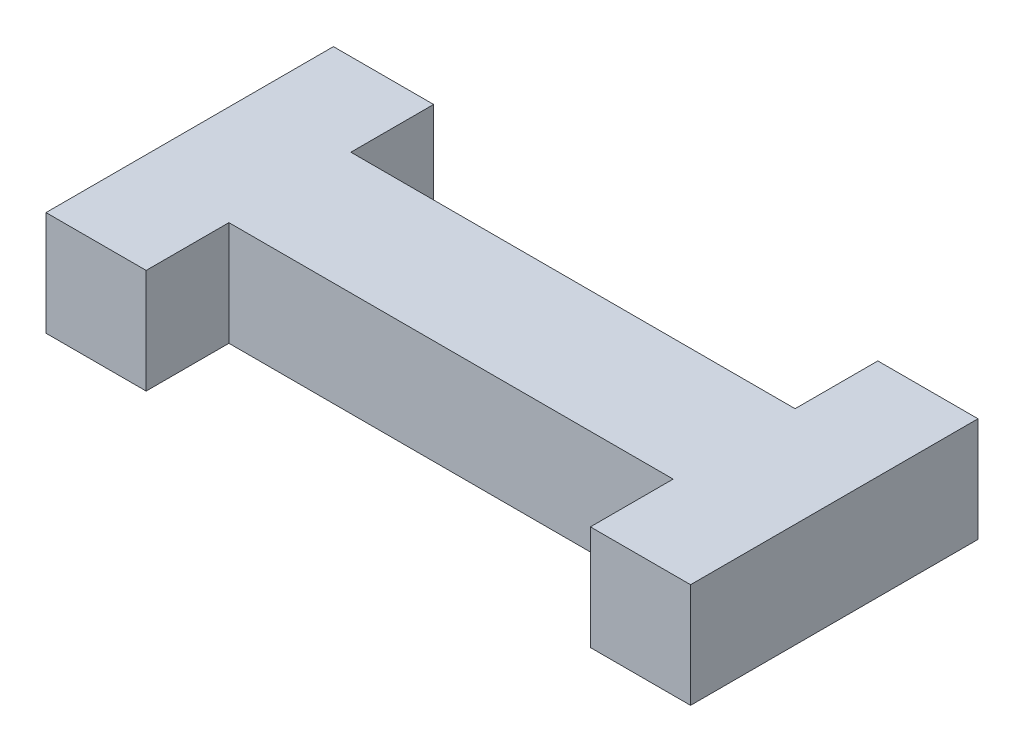
ISO-10303-21;
HEADER;
FILE_DESCRIPTION(('STEP AP214'),'2;1');
FILE_NAME('part.step','',(''),(''),'','','');
FILE_SCHEMA(('AUTOMOTIVE_DESIGN { 1 0 10303 214 1 1 1 1 }'));
ENDSEC;
DATA;
#1=APPLICATION_CONTEXT('core data for automotive mechanical design processes');
#2=APPLICATION_PROTOCOL_DEFINITION('international standard','automotive_design',2000,#1);
#3=PRODUCT_CONTEXT('',#1,'mechanical');
#4=PRODUCT('Part','Part','',(#3));
#5=PRODUCT_RELATED_PRODUCT_CATEGORY('part','',(#4));
#6=PRODUCT_DEFINITION_FORMATION('','',#4);
#7=PRODUCT_DEFINITION_CONTEXT('part definition',#1,'design');
#8=PRODUCT_DEFINITION('design','',#6,#7);
#9=PRODUCT_DEFINITION_SHAPE('','',#8);
#10=(LENGTH_UNIT() NAMED_UNIT(*) SI_UNIT(.MILLI.,.METRE.));
#11=(NAMED_UNIT(*) PLANE_ANGLE_UNIT() SI_UNIT($,.RADIAN.));
#12=(NAMED_UNIT(*) SI_UNIT($,.STERADIAN.) SOLID_ANGLE_UNIT());
#13=UNCERTAINTY_MEASURE_WITH_UNIT(LENGTH_MEASURE(1.E-05),#10,'distance_accuracy_value','');
#14=(GEOMETRIC_REPRESENTATION_CONTEXT(3) GLOBAL_UNCERTAINTY_ASSIGNED_CONTEXT((#13)) GLOBAL_UNIT_ASSIGNED_CONTEXT((#10,
#11,#12)) REPRESENTATION_CONTEXT('',''));
#15=CARTESIAN_POINT('',(0.,0.,0.));
#16=DIRECTION('',(0.,0.,1.));
#17=DIRECTION('',(1.,0.,0.));
#18=AXIS2_PLACEMENT_3D('',#15,#16,#17);
#19=CARTESIAN_POINT('',(12.954,6.096,-8.382));
#20=DIRECTION('',(0.,0.,1.));
#21=DIRECTION('',(1.,0.,0.));
#22=AXIS2_PLACEMENT_3D('',#19,#20,#21);
#23=PLANE('',#22);
#24=DIRECTION('',(-1.,0.,0.));
#25=VECTOR('',#24,1.);
#26=CARTESIAN_POINT('',(12.954,0.,-8.382));
#27=LINE('',#26,#25);
#28=CARTESIAN_POINT('',(18.796,0.,-8.382));
#29=VERTEX_POINT('',#28);
#30=CARTESIAN_POINT('',(12.954,0.,-8.382));
#31=VERTEX_POINT('',#30);
#32=EDGE_CURVE('E164',#29,#31,#27,.T.);
#33=ORIENTED_EDGE('',*,*,#32,.T.);
#34=DIRECTION('',(0.,-1.,0.));
#35=VECTOR('',#34,1.);
#36=CARTESIAN_POINT('',(12.954,6.096,-8.382));
#37=LINE('',#36,#35);
#38=CARTESIAN_POINT('',(12.954,6.096,-8.382));
#39=VERTEX_POINT('',#38);
#40=EDGE_CURVE('E11',#39,#31,#37,.T.);
#41=ORIENTED_EDGE('',*,*,#40,.F.);
#42=DIRECTION('',(-1.,0.,0.));
#43=VECTOR('',#42,1.);
#44=CARTESIAN_POINT('',(12.954,6.096,-8.382));
#45=LINE('',#44,#43);
#46=CARTESIAN_POINT('',(18.796,6.096,-8.382));
#47=VERTEX_POINT('',#46);
#48=EDGE_CURVE('E198',#47,#39,#45,.T.);
#49=ORIENTED_EDGE('',*,*,#48,.F.);
#50=DIRECTION('',(0.,-1.,0.));
#51=VECTOR('',#50,1.);
#52=CARTESIAN_POINT('',(18.796,6.096,-8.382));
#53=LINE('',#52,#51);
#54=EDGE_CURVE('E160',#47,#29,#53,.T.);
#55=ORIENTED_EDGE('',*,*,#54,.T.);
#56=EDGE_LOOP('',(#33,#41,#49,#55));
#57=FACE_BOUND('',#56,.T.);
#58=ADVANCED_FACE('F39',(#57),#23,.F.);
#59=CARTESIAN_POINT('',(12.954,6.096,-3.556));
#60=DIRECTION('',(1.,0.,0.));
#61=DIRECTION('',(0.,0.,-1.));
#62=AXIS2_PLACEMENT_3D('',#59,#60,#61);
#63=PLANE('',#62);
#64=DIRECTION('',(0.,0.,1.));
#65=VECTOR('',#64,1.);
#66=CARTESIAN_POINT('',(12.954,0.,-3.556));
#67=LINE('',#66,#65);
#68=CARTESIAN_POINT('',(12.954,0.,-3.556));
#69=VERTEX_POINT('',#68);
#70=EDGE_CURVE('E168',#31,#69,#67,.T.);
#71=ORIENTED_EDGE('',*,*,#70,.T.);
#72=DIRECTION('',(0.,-1.,0.));
#73=VECTOR('',#72,1.);
#74=CARTESIAN_POINT('',(12.954,6.096,-3.556));
#75=LINE('',#74,#73);
#76=CARTESIAN_POINT('',(12.954,6.096,-3.556));
#77=VERTEX_POINT('',#76);
#78=EDGE_CURVE('E48',#77,#69,#75,.T.);
#79=ORIENTED_EDGE('',*,*,#78,.F.);
#80=DIRECTION('',(0.,0.,1.));
#81=VECTOR('',#80,1.);
#82=CARTESIAN_POINT('',(12.954,6.096,-3.556));
#83=LINE('',#82,#81);
#84=EDGE_CURVE('E111',#39,#77,#83,.T.);
#85=ORIENTED_EDGE('',*,*,#84,.F.);
#86=ORIENTED_EDGE('',*,*,#40,.T.);
#87=EDGE_LOOP('',(#71,#79,#85,#86));
#88=FACE_BOUND('',#87,.T.);
#89=ADVANCED_FACE('F292',(#88),#63,.F.);
#90=CARTESIAN_POINT('',(12.954,6.096,-3.556));
#91=DIRECTION('',(0.,0.,1.));
#92=DIRECTION('',(1.,0.,0.));
#93=AXIS2_PLACEMENT_3D('',#90,#91,#92);
#94=PLANE('',#93);
#95=DIRECTION('',(-1.,0.,0.));
#96=VECTOR('',#95,1.);
#97=CARTESIAN_POINT('',(12.954,0.,-3.556));
#98=LINE('',#97,#96);
#99=CARTESIAN_POINT('',(-12.954,0.,-3.556));
#100=VERTEX_POINT('',#99);
#101=EDGE_CURVE('E171',#69,#100,#98,.T.);
#102=ORIENTED_EDGE('',*,*,#101,.T.);
#103=DIRECTION('',(0.,-1.,0.));
#104=VECTOR('',#103,1.);
#105=CARTESIAN_POINT('',(-12.954,6.096,-3.556));
#106=LINE('',#105,#104);
#107=CARTESIAN_POINT('',(-12.954,6.096,-3.556));
#108=VERTEX_POINT('',#107);
#109=EDGE_CURVE('E225',#108,#100,#106,.T.);
#110=ORIENTED_EDGE('',*,*,#109,.F.);
#111=DIRECTION('',(-1.,0.,0.));
#112=VECTOR('',#111,1.);
#113=CARTESIAN_POINT('',(12.954,6.096,-3.556));
#114=LINE('',#113,#112);
#115=EDGE_CURVE('E235',#77,#108,#114,.T.);
#116=ORIENTED_EDGE('',*,*,#115,.F.);
#117=ORIENTED_EDGE('',*,*,#78,.T.);
#118=EDGE_LOOP('',(#102,#110,#116,#117));
#119=FACE_BOUND('',#118,.T.);
#120=ADVANCED_FACE('F233',(#119),#94,.F.);
#121=CARTESIAN_POINT('',(-12.954,6.096,-3.556));
#122=DIRECTION('',(-1.,0.,0.));
#123=DIRECTION('',(0.,0.,1.));
#124=AXIS2_PLACEMENT_3D('',#121,#122,#123);
#125=PLANE('',#124);
#126=DIRECTION('',(0.,0.,-1.));
#127=VECTOR('',#126,1.);
#128=CARTESIAN_POINT('',(-12.954,0.,-3.556));
#129=LINE('',#128,#127);
#130=CARTESIAN_POINT('',(-12.954,0.,-8.382));
#131=VERTEX_POINT('',#130);
#132=EDGE_CURVE('E174',#100,#131,#129,.T.);
#133=ORIENTED_EDGE('',*,*,#132,.T.);
#134=DIRECTION('',(0.,-1.,0.));
#135=VECTOR('',#134,1.);
#136=CARTESIAN_POINT('',(-12.954,6.096,-8.382));
#137=LINE('',#136,#135);
#138=CARTESIAN_POINT('',(-12.954,6.096,-8.382));
#139=VERTEX_POINT('',#138);
#140=EDGE_CURVE('E221',#139,#131,#137,.T.);
#141=ORIENTED_EDGE('',*,*,#140,.F.);
#142=DIRECTION('',(0.,0.,-1.));
#143=VECTOR('',#142,1.);
#144=CARTESIAN_POINT('',(-12.954,6.096,-3.556));
#145=LINE('',#144,#143);
#146=EDGE_CURVE('E254',#108,#139,#145,.T.);
#147=ORIENTED_EDGE('',*,*,#146,.F.);
#148=ORIENTED_EDGE('',*,*,#109,.T.);
#149=EDGE_LOOP('',(#133,#141,#147,#148));
#150=FACE_BOUND('',#149,.T.);
#151=ADVANCED_FACE('F244',(#150),#125,.F.);
#152=CARTESIAN_POINT('',(-12.954,6.096,-8.382));
#153=DIRECTION('',(0.,0.,1.));
#154=DIRECTION('',(1.,0.,0.));
#155=AXIS2_PLACEMENT_3D('',#152,#153,#154);
#156=PLANE('',#155);
#157=DIRECTION('',(-1.,0.,0.));
#158=VECTOR('',#157,1.);
#159=CARTESIAN_POINT('',(-12.954,0.,-8.382));
#160=LINE('',#159,#158);
#161=CARTESIAN_POINT('',(-18.796,0.,-8.382));
#162=VERTEX_POINT('',#161);
#163=EDGE_CURVE('E177',#131,#162,#160,.T.);
#164=ORIENTED_EDGE('',*,*,#163,.T.);
#165=DIRECTION('',(0.,-1.,0.));
#166=VECTOR('',#165,1.);
#167=CARTESIAN_POINT('',(-18.796,6.096,-8.382));
#168=LINE('',#167,#166);
#169=CARTESIAN_POINT('',(-18.796,6.096,-8.382));
#170=VERTEX_POINT('',#169);
#171=EDGE_CURVE('E217',#170,#162,#168,.T.);
#172=ORIENTED_EDGE('',*,*,#171,.F.);
#173=DIRECTION('',(-1.,0.,0.));
#174=VECTOR('',#173,1.);
#175=CARTESIAN_POINT('',(-12.954,6.096,-8.382));
#176=LINE('',#175,#174);
#177=EDGE_CURVE('E250',#139,#170,#176,.T.);
#178=ORIENTED_EDGE('',*,*,#177,.F.);
#179=ORIENTED_EDGE('',*,*,#140,.T.);
#180=EDGE_LOOP('',(#164,#172,#178,#179));
#181=FACE_BOUND('',#180,.T.);
#182=ADVANCED_FACE('F248',(#181),#156,.F.);
#183=CARTESIAN_POINT('',(-18.796,6.096,-8.382));
#184=DIRECTION('',(1.,0.,0.));
#185=DIRECTION('',(0.,0.,-1.));
#186=AXIS2_PLACEMENT_3D('',#183,#184,#185);
#187=PLANE('',#186);
#188=DIRECTION('',(0.,0.,1.));
#189=VECTOR('',#188,1.);
#190=CARTESIAN_POINT('',(-18.796,0.,-8.382));
#191=LINE('',#190,#189);
#192=CARTESIAN_POINT('',(-18.796,0.,8.38199999999999));
#193=VERTEX_POINT('',#192);
#194=EDGE_CURVE('E180',#162,#193,#191,.T.);
#195=ORIENTED_EDGE('',*,*,#194,.T.);
#196=DIRECTION('',(0.,-1.,0.));
#197=VECTOR('',#196,1.);
#198=CARTESIAN_POINT('',(-18.796,6.096,8.38199999999999));
#199=LINE('',#198,#197);
#200=CARTESIAN_POINT('',(-18.796,6.096,8.38199999999999));
#201=VERTEX_POINT('',#200);
#202=EDGE_CURVE('E213',#201,#193,#199,.T.);
#203=ORIENTED_EDGE('',*,*,#202,.F.);
#204=DIRECTION('',(0.,0.,1.));
#205=VECTOR('',#204,1.);
#206=CARTESIAN_POINT('',(-18.796,6.096,-8.382));
#207=LINE('',#206,#205);
#208=EDGE_CURVE('E253',#170,#201,#207,.T.);
#209=ORIENTED_EDGE('',*,*,#208,.F.);
#210=ORIENTED_EDGE('',*,*,#171,.T.);
#211=EDGE_LOOP('',(#195,#203,#209,#210));
#212=FACE_BOUND('',#211,.T.);
#213=ADVANCED_FACE('F305',(#212),#187,.F.);
#214=CARTESIAN_POINT('',(-12.954,6.096,8.38199999999999));
#215=DIRECTION('',(0.,0.,-1.));
#216=DIRECTION('',(-1.,0.,0.));
#217=AXIS2_PLACEMENT_3D('',#214,#215,#216);
#218=PLANE('',#217);
#219=DIRECTION('',(1.,0.,0.));
#220=VECTOR('',#219,1.);
#221=CARTESIAN_POINT('',(-12.954,0.,8.38199999999999));
#222=LINE('',#221,#220);
#223=CARTESIAN_POINT('',(-12.954,0.,8.38199999999999));
#224=VERTEX_POINT('',#223);
#225=EDGE_CURVE('E183',#193,#224,#222,.T.);
#226=ORIENTED_EDGE('',*,*,#225,.T.);
#227=DIRECTION('',(0.,-1.,0.));
#228=VECTOR('',#227,1.);
#229=CARTESIAN_POINT('',(-12.954,6.096,8.38199999999999));
#230=LINE('',#229,#228);
#231=CARTESIAN_POINT('',(-12.954,6.096,8.38199999999999));
#232=VERTEX_POINT('',#231);
#233=EDGE_CURVE('E209',#232,#224,#230,.T.);
#234=ORIENTED_EDGE('',*,*,#233,.F.);
#235=DIRECTION('',(1.,0.,0.));
#236=VECTOR('',#235,1.);
#237=CARTESIAN_POINT('',(-12.954,6.096,8.38199999999999));
#238=LINE('',#237,#236);
#239=EDGE_CURVE('E258',#201,#232,#238,.T.);
#240=ORIENTED_EDGE('',*,*,#239,.F.);
#241=ORIENTED_EDGE('',*,*,#202,.T.);
#242=EDGE_LOOP('',(#226,#234,#240,#241));
#243=FACE_BOUND('',#242,.T.);
#244=ADVANCED_FACE('F308',(#243),#218,.F.);
#245=CARTESIAN_POINT('',(-12.954,6.096,3.55599999999999));
#246=DIRECTION('',(-1.,0.,0.));
#247=DIRECTION('',(0.,0.,1.));
#248=AXIS2_PLACEMENT_3D('',#245,#246,#247);
#249=PLANE('',#248);
#250=DIRECTION('',(0.,0.,-1.));
#251=VECTOR('',#250,1.);
#252=CARTESIAN_POINT('',(-12.954,0.,3.55599999999999));
#253=LINE('',#252,#251);
#254=CARTESIAN_POINT('',(-12.954,0.,3.55599999999999));
#255=VERTEX_POINT('',#254);
#256=EDGE_CURVE('E186',#224,#255,#253,.T.);
#257=ORIENTED_EDGE('',*,*,#256,.T.);
#258=DIRECTION('',(0.,-1.,0.));
#259=VECTOR('',#258,1.);
#260=CARTESIAN_POINT('',(-12.954,6.096,3.55599999999999));
#261=LINE('',#260,#259);
#262=CARTESIAN_POINT('',(-12.954,6.096,3.55599999999999));
#263=VERTEX_POINT('',#262);
#264=EDGE_CURVE('E205',#263,#255,#261,.T.);
#265=ORIENTED_EDGE('',*,*,#264,.F.);
#266=DIRECTION('',(0.,0.,-1.));
#267=VECTOR('',#266,1.);
#268=CARTESIAN_POINT('',(-12.954,6.096,3.55599999999999));
#269=LINE('',#268,#267);
#270=EDGE_CURVE('E265',#232,#263,#269,.T.);
#271=ORIENTED_EDGE('',*,*,#270,.F.);
#272=ORIENTED_EDGE('',*,*,#233,.T.);
#273=EDGE_LOOP('',(#257,#265,#271,#272));
#274=FACE_BOUND('',#273,.T.);
#275=ADVANCED_FACE('F273',(#274),#249,.F.);
#276=CARTESIAN_POINT('',(12.954,6.096,3.55599999999999));
#277=DIRECTION('',(0.,0.,-1.));
#278=DIRECTION('',(-1.,0.,0.));
#279=AXIS2_PLACEMENT_3D('',#276,#277,#278);
#280=PLANE('',#279);
#281=DIRECTION('',(1.,0.,0.));
#282=VECTOR('',#281,1.);
#283=CARTESIAN_POINT('',(12.954,0.,3.55599999999999));
#284=LINE('',#283,#282);
#285=CARTESIAN_POINT('',(12.954,0.,3.55599999999999));
#286=VERTEX_POINT('',#285);
#287=EDGE_CURVE('E189',#255,#286,#284,.T.);
#288=ORIENTED_EDGE('',*,*,#287,.T.);
#289=DIRECTION('',(0.,-1.,0.));
#290=VECTOR('',#289,1.);
#291=CARTESIAN_POINT('',(12.954,6.096,3.55599999999999));
#292=LINE('',#291,#290);
#293=CARTESIAN_POINT('',(12.954,6.096,3.55599999999999));
#294=VERTEX_POINT('',#293);
#295=EDGE_CURVE('E153',#294,#286,#292,.T.);
#296=ORIENTED_EDGE('',*,*,#295,.F.);
#297=DIRECTION('',(1.,0.,0.));
#298=VECTOR('',#297,1.);
#299=CARTESIAN_POINT('',(12.954,6.096,3.55599999999999));
#300=LINE('',#299,#298);
#301=EDGE_CURVE('E142',#263,#294,#300,.T.);
#302=ORIENTED_EDGE('',*,*,#301,.F.);
#303=ORIENTED_EDGE('',*,*,#264,.T.);
#304=EDGE_LOOP('',(#288,#296,#302,#303));
#305=FACE_BOUND('',#304,.T.);
#306=ADVANCED_FACE('F277',(#305),#280,.F.);
#307=CARTESIAN_POINT('',(12.954,6.096,3.55599999999999));
#308=DIRECTION('',(1.,0.,0.));
#309=DIRECTION('',(0.,0.,-1.));
#310=AXIS2_PLACEMENT_3D('',#307,#308,#309);
#311=PLANE('',#310);
#312=DIRECTION('',(0.,0.,1.));
#313=VECTOR('',#312,1.);
#314=CARTESIAN_POINT('',(12.954,0.,3.55599999999999));
#315=LINE('',#314,#313);
#316=CARTESIAN_POINT('',(12.954,0.,8.38199999999999));
#317=VERTEX_POINT('',#316);
#318=EDGE_CURVE('E151',#286,#317,#315,.T.);
#319=ORIENTED_EDGE('',*,*,#318,.T.);
#320=DIRECTION('',(0.,-1.,0.));
#321=VECTOR('',#320,1.);
#322=CARTESIAN_POINT('',(12.954,6.096,8.38199999999999));
#323=LINE('',#322,#321);
#324=CARTESIAN_POINT('',(12.954,6.096,8.38199999999999));
#325=VERTEX_POINT('',#324);
#326=EDGE_CURVE('E148',#325,#317,#323,.T.);
#327=ORIENTED_EDGE('',*,*,#326,.F.);
#328=DIRECTION('',(0.,0.,1.));
#329=VECTOR('',#328,1.);
#330=CARTESIAN_POINT('',(12.954,6.096,3.55599999999999));
#331=LINE('',#330,#329);
#332=EDGE_CURVE('E136',#294,#325,#331,.T.);
#333=ORIENTED_EDGE('',*,*,#332,.F.);
#334=ORIENTED_EDGE('',*,*,#295,.T.);
#335=EDGE_LOOP('',(#319,#327,#333,#334));
#336=FACE_BOUND('',#335,.T.);
#337=ADVANCED_FACE('F149',(#336),#311,.F.);
#338=CARTESIAN_POINT('',(12.954,6.096,8.38199999999999));
#339=DIRECTION('',(0.,0.,-1.));
#340=DIRECTION('',(-1.,0.,0.));
#341=AXIS2_PLACEMENT_3D('',#338,#339,#340);
#342=PLANE('',#341);
#343=DIRECTION('',(1.,0.,0.));
#344=VECTOR('',#343,1.);
#345=CARTESIAN_POINT('',(12.954,0.,8.38199999999999));
#346=LINE('',#345,#344);
#347=CARTESIAN_POINT('',(18.796,0.,8.38199999999999));
#348=VERTEX_POINT('',#347);
#349=EDGE_CURVE('E97',#317,#348,#346,.T.);
#350=ORIENTED_EDGE('',*,*,#349,.T.);
#351=DIRECTION('',(0.,-1.,0.));
#352=VECTOR('',#351,1.);
#353=CARTESIAN_POINT('',(18.796,6.096,8.38199999999999));
#354=LINE('',#353,#352);
#355=CARTESIAN_POINT('',(18.796,6.096,8.38199999999999));
#356=VERTEX_POINT('',#355);
#357=EDGE_CURVE('E154',#356,#348,#354,.T.);
#358=ORIENTED_EDGE('',*,*,#357,.F.);
#359=DIRECTION('',(1.,0.,0.));
#360=VECTOR('',#359,1.);
#361=CARTESIAN_POINT('',(12.954,6.096,8.38199999999999));
#362=LINE('',#361,#360);
#363=EDGE_CURVE('E140',#325,#356,#362,.T.);
#364=ORIENTED_EDGE('',*,*,#363,.F.);
#365=ORIENTED_EDGE('',*,*,#326,.T.);
#366=EDGE_LOOP('',(#350,#358,#364,#365));
#367=FACE_BOUND('',#366,.T.);
#368=ADVANCED_FACE('F156',(#367),#342,.F.);
#369=CARTESIAN_POINT('',(18.796,6.096,-8.382));
#370=DIRECTION('',(-1.,0.,0.));
#371=DIRECTION('',(0.,0.,1.));
#372=AXIS2_PLACEMENT_3D('',#369,#370,#371);
#373=PLANE('',#372);
#374=DIRECTION('',(0.,0.,-1.));
#375=VECTOR('',#374,1.);
#376=CARTESIAN_POINT('',(18.796,0.,-8.382));
#377=LINE('',#376,#375);
#378=EDGE_CURVE('E103',#348,#29,#377,.T.);
#379=ORIENTED_EDGE('',*,*,#378,.T.);
#380=ORIENTED_EDGE('',*,*,#54,.F.);
#381=DIRECTION('',(0.,0.,-1.));
#382=VECTOR('',#381,1.);
#383=CARTESIAN_POINT('',(18.796,6.096,-8.382));
#384=LINE('',#383,#382);
#385=EDGE_CURVE('E56',#356,#47,#384,.T.);
#386=ORIENTED_EDGE('',*,*,#385,.F.);
#387=ORIENTED_EDGE('',*,*,#357,.T.);
#388=EDGE_LOOP('',(#379,#380,#386,#387));
#389=FACE_BOUND('',#388,.T.);
#390=ADVANCED_FACE('F281',(#389),#373,.F.);
#391=CARTESIAN_POINT('',(0.,6.096,0.));
#392=DIRECTION('',(0.,-1.,0.));
#393=DIRECTION('',(0.,0.,-1.));
#394=AXIS2_PLACEMENT_3D('',#391,#392,#393);
#395=PLANE('',#394);
#396=ORIENTED_EDGE('',*,*,#48,.T.);
#397=ORIENTED_EDGE('',*,*,#84,.T.);
#398=ORIENTED_EDGE('',*,*,#115,.T.);
#399=ORIENTED_EDGE('',*,*,#146,.T.);
#400=ORIENTED_EDGE('',*,*,#177,.T.);
#401=ORIENTED_EDGE('',*,*,#208,.T.);
#402=ORIENTED_EDGE('',*,*,#239,.T.);
#403=ORIENTED_EDGE('',*,*,#270,.T.);
#404=ORIENTED_EDGE('',*,*,#301,.T.);
#405=ORIENTED_EDGE('',*,*,#332,.T.);
#406=ORIENTED_EDGE('',*,*,#363,.T.);
#407=ORIENTED_EDGE('',*,*,#385,.T.);
#408=EDGE_LOOP('',(#396,#397,#398,#399,#400,#401,#402,#403,#404,#405,#406,#407));
#409=FACE_BOUND('',#408,.T.);
#410=ADVANCED_FACE('F138',(#409),#395,.F.);
#411=CARTESIAN_POINT('',(0.,0.,0.));
#412=DIRECTION('',(0.,-1.,0.));
#413=DIRECTION('',(0.,0.,-1.));
#414=AXIS2_PLACEMENT_3D('',#411,#412,#413);
#415=PLANE('',#414);
#416=ORIENTED_EDGE('',*,*,#32,.F.);
#417=ORIENTED_EDGE('',*,*,#378,.F.);
#418=ORIENTED_EDGE('',*,*,#349,.F.);
#419=ORIENTED_EDGE('',*,*,#318,.F.);
#420=ORIENTED_EDGE('',*,*,#287,.F.);
#421=ORIENTED_EDGE('',*,*,#256,.F.);
#422=ORIENTED_EDGE('',*,*,#225,.F.);
#423=ORIENTED_EDGE('',*,*,#194,.F.);
#424=ORIENTED_EDGE('',*,*,#163,.F.);
#425=ORIENTED_EDGE('',*,*,#132,.F.);
#426=ORIENTED_EDGE('',*,*,#101,.F.);
#427=ORIENTED_EDGE('',*,*,#70,.F.);
#428=EDGE_LOOP('',(#416,#417,#418,#419,#420,#421,#422,#423,#424,#425,#426,#427));
#429=FACE_BOUND('',#428,.T.);
#430=ADVANCED_FACE('F239',(#429),#415,.T.);
#431=CLOSED_SHELL('',(#58,#89,#120,#151,#182,#213,#244,#275,#306,#337,#368,#390,#410,#430));
#432=MANIFOLD_SOLID_BREP('B2',#431);
#433=ADVANCED_BREP_SHAPE_REPRESENTATION('',(#18,#432),#14);
#434=SHAPE_DEFINITION_REPRESENTATION(#9,#433);
ENDSEC;
END-ISO-10303-21;
